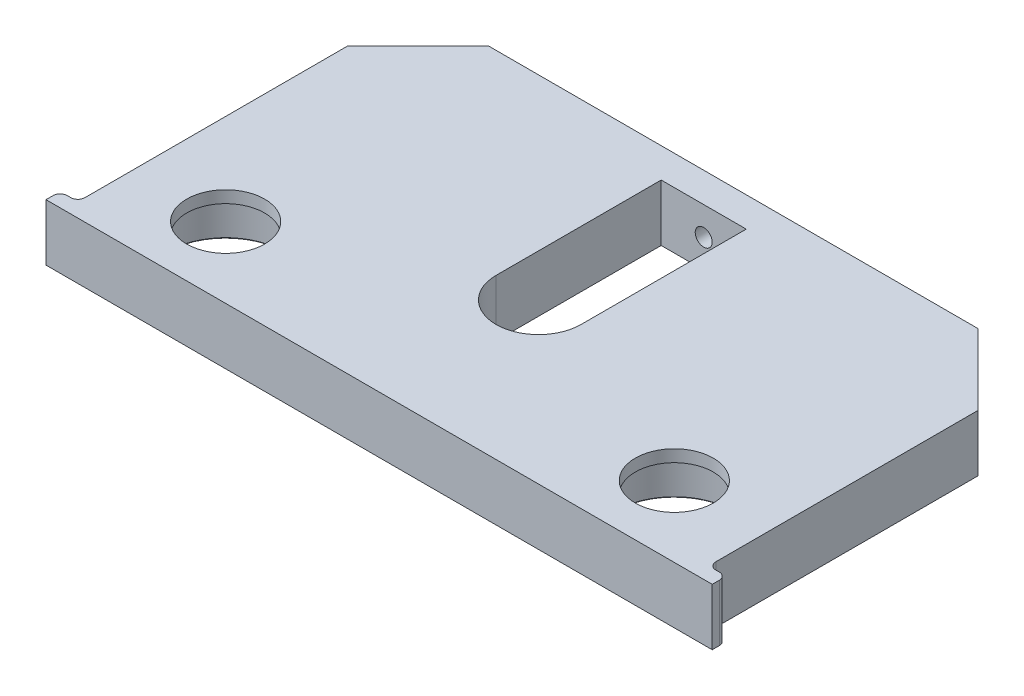
ISO-10303-21;
HEADER;
FILE_DESCRIPTION(('STEP AP214'),'2;1');
FILE_NAME('part.step','',(''),(''),'','','');
FILE_SCHEMA(('AUTOMOTIVE_DESIGN { 1 0 10303 214 1 1 1 1 }'));
ENDSEC;
DATA;
#1=APPLICATION_CONTEXT('core data for automotive mechanical design processes');
#2=APPLICATION_PROTOCOL_DEFINITION('international standard','automotive_design',2000,#1);
#3=PRODUCT_CONTEXT('',#1,'mechanical');
#4=PRODUCT('Part','Part','',(#3));
#5=PRODUCT_RELATED_PRODUCT_CATEGORY('part','',(#4));
#6=PRODUCT_DEFINITION_FORMATION('','',#4);
#7=PRODUCT_DEFINITION_CONTEXT('part definition',#1,'design');
#8=PRODUCT_DEFINITION('design','',#6,#7);
#9=PRODUCT_DEFINITION_SHAPE('','',#8);
#10=(LENGTH_UNIT() NAMED_UNIT(*) SI_UNIT(.MILLI.,.METRE.));
#11=(NAMED_UNIT(*) PLANE_ANGLE_UNIT() SI_UNIT($,.RADIAN.));
#12=(NAMED_UNIT(*) SI_UNIT($,.STERADIAN.) SOLID_ANGLE_UNIT());
#13=UNCERTAINTY_MEASURE_WITH_UNIT(LENGTH_MEASURE(1.E-05),#10,'distance_accuracy_value','');
#14=(GEOMETRIC_REPRESENTATION_CONTEXT(3) GLOBAL_UNCERTAINTY_ASSIGNED_CONTEXT((#13)) GLOBAL_UNIT_ASSIGNED_CONTEXT((#10,
#11,#12)) REPRESENTATION_CONTEXT('',''));
#15=CARTESIAN_POINT('',(0.,0.,0.));
#16=DIRECTION('',(0.,0.,1.));
#17=DIRECTION('',(1.,0.,0.));
#18=AXIS2_PLACEMENT_3D('',#15,#16,#17);
#19=CARTESIAN_POINT('',(-316.5,40.,-100.));
#20=DIRECTION('',(0.,-1.,0.));
#21=DIRECTION('',(0.,0.,-1.));
#22=AXIS2_PLACEMENT_3D('',#19,#20,#21);
#23=CYLINDRICAL_SURFACE('',#22,55.);
#24=CARTESIAN_POINT('',(-316.5,40.,-100.));
#25=DIRECTION('',(0.,1.,0.));
#26=DIRECTION('',(0.,0.,1.));
#27=AXIS2_PLACEMENT_3D('',#24,#25,#26);
#28=CIRCLE('',#27,55.);
#29=CARTESIAN_POINT('',(-316.5,40.,-45.));
#30=VERTEX_POINT('',#29);
#31=EDGE_CURVE('E231',#30,#30,#28,.T.);
#32=ORIENTED_EDGE('',*,*,#31,.T.);
#33=EDGE_LOOP('',(#32));
#34=FACE_BOUND('',#33,.T.);
#35=CARTESIAN_POINT('',(-316.5,23.,-100.));
#36=DIRECTION('',(0.,-1.,0.));
#37=DIRECTION('',(0.,0.,-1.));
#38=AXIS2_PLACEMENT_3D('',#35,#36,#37);
#39=CIRCLE('',#38,55.);
#40=CARTESIAN_POINT('',(-316.5,23.,-155.));
#41=VERTEX_POINT('',#40);
#42=EDGE_CURVE('E327',#41,#41,#39,.T.);
#43=ORIENTED_EDGE('',*,*,#42,.T.);
#44=EDGE_LOOP('',(#43));
#45=FACE_BOUND('',#44,.T.);
#46=ADVANCED_FACE('F47',(#34,#45),#23,.F.);
#47=CARTESIAN_POINT('',(316.5,40.,-100.));
#48=DIRECTION('',(0.,-1.,0.));
#49=DIRECTION('',(0.,0.,-1.));
#50=AXIS2_PLACEMENT_3D('',#47,#48,#49);
#51=CYLINDRICAL_SURFACE('',#50,55.);
#52=CARTESIAN_POINT('',(316.5,40.,-100.));
#53=DIRECTION('',(0.,1.,0.));
#54=DIRECTION('',(0.,0.,1.));
#55=AXIS2_PLACEMENT_3D('',#52,#53,#54);
#56=CIRCLE('',#55,55.);
#57=CARTESIAN_POINT('',(316.5,40.,-45.));
#58=VERTEX_POINT('',#57);
#59=EDGE_CURVE('E234',#58,#58,#56,.F.);
#60=ORIENTED_EDGE('',*,*,#59,.F.);
#61=EDGE_LOOP('',(#60));
#62=FACE_BOUND('',#61,.T.);
#63=CARTESIAN_POINT('',(316.5,23.,-100.));
#64=DIRECTION('',(0.,-1.,0.));
#65=DIRECTION('',(0.,0.,-1.));
#66=AXIS2_PLACEMENT_3D('',#63,#64,#65);
#67=CIRCLE('',#66,55.);
#68=CARTESIAN_POINT('',(316.5,23.,-155.));
#69=VERTEX_POINT('',#68);
#70=EDGE_CURVE('E324',#69,#69,#67,.F.);
#71=ORIENTED_EDGE('',*,*,#70,.F.);
#72=EDGE_LOOP('',(#71));
#73=FACE_BOUND('',#72,.T.);
#74=ADVANCED_FACE('F368',(#62,#73),#51,.F.);
#75=CARTESIAN_POINT('',(-445.,40.,1.30012959462683E-13));
#76=DIRECTION('',(1.,0.,0.));
#77=DIRECTION('',(0.,0.,-1.));
#78=AXIS2_PLACEMENT_3D('',#75,#76,#77);
#79=PLANE('',#78);
#80=DIRECTION('',(0.,0.,1.));
#81=VECTOR('',#80,1.);
#82=CARTESIAN_POINT('',(-445.,-40.,1.30012959462683E-13));
#83=LINE('',#82,#81);
#84=CARTESIAN_POINT('',(-445.,-40.,-400.));
#85=VERTEX_POINT('',#84);
#86=CARTESIAN_POINT('',(-445.,-40.,-30.));
#87=VERTEX_POINT('',#86);
#88=EDGE_CURVE('E247',#85,#87,#83,.T.);
#89=ORIENTED_EDGE('',*,*,#88,.T.);
#90=DIRECTION('',(0.,-1.,0.));
#91=VECTOR('',#90,1.);
#92=CARTESIAN_POINT('',(-445.,40.,-30.));
#93=LINE('',#92,#91);
#94=CARTESIAN_POINT('',(-445.,40.,-30.));
#95=VERTEX_POINT('',#94);
#96=EDGE_CURVE('E304',#87,#95,#93,.F.);
#97=ORIENTED_EDGE('',*,*,#96,.T.);
#98=DIRECTION('',(0.,0.,1.));
#99=VECTOR('',#98,1.);
#100=CARTESIAN_POINT('',(-445.,40.,1.30012959462683E-13));
#101=LINE('',#100,#99);
#102=CARTESIAN_POINT('',(-445.,40.,-400.));
#103=VERTEX_POINT('',#102);
#104=EDGE_CURVE('E208',#103,#95,#101,.T.);
#105=ORIENTED_EDGE('',*,*,#104,.F.);
#106=DIRECTION('',(0.,-1.,0.));
#107=VECTOR('',#106,1.);
#108=CARTESIAN_POINT('',(-445.,40.,-400.));
#109=LINE('',#108,#107);
#110=EDGE_CURVE('E184',#103,#85,#109,.T.);
#111=ORIENTED_EDGE('',*,*,#110,.T.);
#112=EDGE_LOOP('',(#89,#97,#105,#111));
#113=FACE_BOUND('',#112,.T.);
#114=ADVANCED_FACE('F375',(#113),#79,.F.);
#115=CARTESIAN_POINT('',(0.,40.,-20.0000000000002));
#116=DIRECTION('',(0.,0.,1.));
#117=DIRECTION('',(1.,0.,0.));
#118=AXIS2_PLACEMENT_3D('',#115,#116,#117);
#119=PLANE('',#118);
#120=DIRECTION('',(-1.,0.,0.));
#121=VECTOR('',#120,1.);
#122=CARTESIAN_POINT('',(0.,-40.,-20.0000000000002));
#123=LINE('',#122,#121);
#124=CARTESIAN_POINT('',(-455.,-40.,-20.));
#125=VERTEX_POINT('',#124);
#126=CARTESIAN_POINT('',(-460.,-40.,-20.));
#127=VERTEX_POINT('',#126);
#128=EDGE_CURVE('E250',#125,#127,#123,.T.);
#129=ORIENTED_EDGE('',*,*,#128,.T.);
#130=DIRECTION('',(0.,-1.,0.));
#131=VECTOR('',#130,1.);
#132=CARTESIAN_POINT('',(-460.,40.,-20.));
#133=LINE('',#132,#131);
#134=CARTESIAN_POINT('',(-460.,40.,-20.));
#135=VERTEX_POINT('',#134);
#136=EDGE_CURVE('E299',#127,#135,#133,.F.);
#137=ORIENTED_EDGE('',*,*,#136,.T.);
#138=DIRECTION('',(-1.,0.,0.));
#139=VECTOR('',#138,1.);
#140=CARTESIAN_POINT('',(0.,40.,-20.0000000000002));
#141=LINE('',#140,#139);
#142=CARTESIAN_POINT('',(-455.,40.,-20.));
#143=VERTEX_POINT('',#142);
#144=EDGE_CURVE('E211',#143,#135,#141,.T.);
#145=ORIENTED_EDGE('',*,*,#144,.F.);
#146=DIRECTION('',(0.,-1.,0.));
#147=VECTOR('',#146,1.);
#148=CARTESIAN_POINT('',(-455.,-40.,-20.));
#149=LINE('',#148,#147);
#150=EDGE_CURVE('E296',#143,#125,#149,.T.);
#151=ORIENTED_EDGE('',*,*,#150,.T.);
#152=EDGE_LOOP('',(#129,#137,#145,#151));
#153=FACE_BOUND('',#152,.T.);
#154=ADVANCED_FACE('F414',(#153),#119,.F.);
#155=CARTESIAN_POINT('',(-470.,40.,0.));
#156=DIRECTION('',(1.,0.,0.));
#157=DIRECTION('',(0.,0.,-1.));
#158=AXIS2_PLACEMENT_3D('',#155,#156,#157);
#159=PLANE('',#158);
#160=DIRECTION('',(0.,0.,1.));
#161=VECTOR('',#160,1.);
#162=CARTESIAN_POINT('',(-470.,40.,0.));
#163=LINE('',#162,#161);
#164=CARTESIAN_POINT('',(-470.,40.,-9.99999999999999));
#165=VERTEX_POINT('',#164);
#166=CARTESIAN_POINT('',(-470.,40.,0.));
#167=VERTEX_POINT('',#166);
#168=EDGE_CURVE('E214',#165,#167,#163,.T.);
#169=ORIENTED_EDGE('',*,*,#168,.F.);
#170=DIRECTION('',(0.,-1.,0.));
#171=VECTOR('',#170,1.);
#172=CARTESIAN_POINT('',(-470.,40.,-9.99999999999999));
#173=LINE('',#172,#171);
#174=CARTESIAN_POINT('',(-470.,-40.,-9.99999999999999));
#175=VERTEX_POINT('',#174);
#176=EDGE_CURVE('E285',#165,#175,#173,.T.);
#177=ORIENTED_EDGE('',*,*,#176,.T.);
#178=DIRECTION('',(0.,0.,1.));
#179=VECTOR('',#178,1.);
#180=CARTESIAN_POINT('',(-470.,-40.,0.));
#181=LINE('',#180,#179);
#182=CARTESIAN_POINT('',(-470.,-40.,0.));
#183=VERTEX_POINT('',#182);
#184=EDGE_CURVE('E253',#175,#183,#181,.T.);
#185=ORIENTED_EDGE('',*,*,#184,.T.);
#186=DIRECTION('',(0.,-1.,0.));
#187=VECTOR('',#186,1.);
#188=CARTESIAN_POINT('',(-470.,40.,0.));
#189=LINE('',#188,#187);
#190=EDGE_CURVE('E282',#167,#183,#189,.T.);
#191=ORIENTED_EDGE('',*,*,#190,.F.);
#192=EDGE_LOOP('',(#169,#177,#185,#191));
#193=FACE_BOUND('',#192,.T.);
#194=ADVANCED_FACE('F410',(#193),#159,.F.);
#195=CARTESIAN_POINT('',(0.,40.,-2.55378105461486E-13));
#196=DIRECTION('',(0.,0.,-1.));
#197=DIRECTION('',(-1.,0.,0.));
#198=AXIS2_PLACEMENT_3D('',#195,#196,#197);
#199=PLANE('',#198);
#200=DIRECTION('',(1.,0.,0.));
#201=VECTOR('',#200,1.);
#202=CARTESIAN_POINT('',(0.,-40.,-2.55378105461486E-13));
#203=LINE('',#202,#201);
#204=CARTESIAN_POINT('',(470.,-40.,0.));
#205=VERTEX_POINT('',#204);
#206=EDGE_CURVE('E255',#183,#205,#203,.T.);
#207=ORIENTED_EDGE('',*,*,#206,.T.);
#208=DIRECTION('',(0.,-1.,0.));
#209=VECTOR('',#208,1.);
#210=CARTESIAN_POINT('',(470.,40.,0.));
#211=LINE('',#210,#209);
#212=CARTESIAN_POINT('',(470.,40.,0.));
#213=VERTEX_POINT('',#212);
#214=EDGE_CURVE('E279',#213,#205,#211,.T.);
#215=ORIENTED_EDGE('',*,*,#214,.F.);
#216=DIRECTION('',(1.,0.,0.));
#217=VECTOR('',#216,1.);
#218=CARTESIAN_POINT('',(0.,40.,-2.55378105461486E-13));
#219=LINE('',#218,#217);
#220=EDGE_CURVE('E216',#167,#213,#219,.T.);
#221=ORIENTED_EDGE('',*,*,#220,.F.);
#222=ORIENTED_EDGE('',*,*,#190,.T.);
#223=EDGE_LOOP('',(#207,#215,#221,#222));
#224=FACE_BOUND('',#223,.T.);
#225=ADVANCED_FACE('F406',(#224),#199,.F.);
#226=CARTESIAN_POINT('',(470.,40.,0.));
#227=DIRECTION('',(1.,0.,0.));
#228=DIRECTION('',(0.,0.,-1.));
#229=AXIS2_PLACEMENT_3D('',#226,#227,#228);
#230=PLANE('',#229);
#231=DIRECTION('',(0.,0.,1.));
#232=VECTOR('',#231,1.);
#233=CARTESIAN_POINT('',(470.,-40.,0.));
#234=LINE('',#233,#232);
#235=CARTESIAN_POINT('',(470.,-40.,-9.99999999999999));
#236=VERTEX_POINT('',#235);
#237=EDGE_CURVE('E258',#236,#205,#234,.T.);
#238=ORIENTED_EDGE('',*,*,#237,.F.);
#239=DIRECTION('',(0.,-1.,0.));
#240=VECTOR('',#239,1.);
#241=CARTESIAN_POINT('',(470.,40.,-9.99999999999999));
#242=LINE('',#241,#240);
#243=CARTESIAN_POINT('',(470.,40.,-9.99999999999999));
#244=VERTEX_POINT('',#243);
#245=EDGE_CURVE('E311',#236,#244,#242,.F.);
#246=ORIENTED_EDGE('',*,*,#245,.T.);
#247=DIRECTION('',(0.,0.,1.));
#248=VECTOR('',#247,1.);
#249=CARTESIAN_POINT('',(470.,40.,0.));
#250=LINE('',#249,#248);
#251=EDGE_CURVE('E219',#244,#213,#250,.T.);
#252=ORIENTED_EDGE('',*,*,#251,.T.);
#253=ORIENTED_EDGE('',*,*,#214,.T.);
#254=EDGE_LOOP('',(#238,#246,#252,#253));
#255=FACE_BOUND('',#254,.T.);
#256=ADVANCED_FACE('F402',(#255),#230,.T.);
#257=CARTESIAN_POINT('',(0.,40.,-20.0000000000002));
#258=DIRECTION('',(0.,0.,-1.));
#259=DIRECTION('',(-1.,0.,0.));
#260=AXIS2_PLACEMENT_3D('',#257,#258,#259);
#261=PLANE('',#260);
#262=DIRECTION('',(1.,0.,0.));
#263=VECTOR('',#262,1.);
#264=CARTESIAN_POINT('',(0.,40.,-20.0000000000002));
#265=LINE('',#264,#263);
#266=CARTESIAN_POINT('',(455.,40.,-20.));
#267=VERTEX_POINT('',#266);
#268=CARTESIAN_POINT('',(460.,40.,-20.));
#269=VERTEX_POINT('',#268);
#270=EDGE_CURVE('E221',#267,#269,#265,.T.);
#271=ORIENTED_EDGE('',*,*,#270,.T.);
#272=DIRECTION('',(0.,-1.,0.));
#273=VECTOR('',#272,1.);
#274=CARTESIAN_POINT('',(460.,40.,-20.));
#275=LINE('',#274,#273);
#276=CARTESIAN_POINT('',(460.,-40.,-20.));
#277=VERTEX_POINT('',#276);
#278=EDGE_CURVE('E308',#269,#277,#275,.T.);
#279=ORIENTED_EDGE('',*,*,#278,.T.);
#280=DIRECTION('',(1.,0.,0.));
#281=VECTOR('',#280,1.);
#282=CARTESIAN_POINT('',(0.,-40.,-20.0000000000002));
#283=LINE('',#282,#281);
#284=CARTESIAN_POINT('',(455.,-40.,-20.));
#285=VERTEX_POINT('',#284);
#286=EDGE_CURVE('E260',#285,#277,#283,.T.);
#287=ORIENTED_EDGE('',*,*,#286,.F.);
#288=DIRECTION('',(0.,-1.,0.));
#289=VECTOR('',#288,1.);
#290=CARTESIAN_POINT('',(455.,40.,-20.));
#291=LINE('',#290,#289);
#292=EDGE_CURVE('E306',#285,#267,#291,.F.);
#293=ORIENTED_EDGE('',*,*,#292,.T.);
#294=EDGE_LOOP('',(#271,#279,#287,#293));
#295=FACE_BOUND('',#294,.T.);
#296=ADVANCED_FACE('F398',(#295),#261,.T.);
#297=CARTESIAN_POINT('',(445.,40.,0.));
#298=DIRECTION('',(-1.,0.,0.));
#299=DIRECTION('',(0.,0.,1.));
#300=AXIS2_PLACEMENT_3D('',#297,#298,#299);
#301=PLANE('',#300);
#302=DIRECTION('',(0.,0.,-1.));
#303=VECTOR('',#302,1.);
#304=CARTESIAN_POINT('',(445.,40.,0.));
#305=LINE('',#304,#303);
#306=CARTESIAN_POINT('',(445.,40.,-30.));
#307=VERTEX_POINT('',#306);
#308=CARTESIAN_POINT('',(445.,40.,-400.));
#309=VERTEX_POINT('',#308);
#310=EDGE_CURVE('E223',#307,#309,#305,.T.);
#311=ORIENTED_EDGE('',*,*,#310,.F.);
#312=DIRECTION('',(0.,-1.,0.));
#313=VECTOR('',#312,1.);
#314=CARTESIAN_POINT('',(445.,40.,-30.));
#315=LINE('',#314,#313);
#316=CARTESIAN_POINT('',(445.,-40.,-30.));
#317=VERTEX_POINT('',#316);
#318=EDGE_CURVE('E313',#307,#317,#315,.T.);
#319=ORIENTED_EDGE('',*,*,#318,.T.);
#320=DIRECTION('',(0.,0.,-1.));
#321=VECTOR('',#320,1.);
#322=CARTESIAN_POINT('',(445.,-40.,0.));
#323=LINE('',#322,#321);
#324=CARTESIAN_POINT('',(445.,-40.,-400.));
#325=VERTEX_POINT('',#324);
#326=EDGE_CURVE('E263',#317,#325,#323,.T.);
#327=ORIENTED_EDGE('',*,*,#326,.T.);
#328=DIRECTION('',(0.,-1.,0.));
#329=VECTOR('',#328,1.);
#330=CARTESIAN_POINT('',(445.,40.,-400.));
#331=LINE('',#330,#329);
#332=EDGE_CURVE('E276',#309,#325,#331,.T.);
#333=ORIENTED_EDGE('',*,*,#332,.F.);
#334=EDGE_LOOP('',(#311,#319,#327,#333));
#335=FACE_BOUND('',#334,.T.);
#336=ADVANCED_FACE('F394',(#335),#301,.F.);
#337=CARTESIAN_POINT('',(422.5,40.,-422.5));
#338=DIRECTION('',(-0.707106781186548,0.,0.707106781186548));
#339=DIRECTION('',(0.707106781186548,0.,0.707106781186548));
#340=AXIS2_PLACEMENT_3D('',#337,#338,#339);
#341=PLANE('',#340);
#342=DIRECTION('',(-0.707106781186548,0.,-0.707106781186548));
#343=VECTOR('',#342,1.);
#344=CARTESIAN_POINT('',(422.5,-40.,-422.5));
#345=LINE('',#344,#343);
#346=CARTESIAN_POINT('',(345.,-40.,-500.));
#347=VERTEX_POINT('',#346);
#348=EDGE_CURVE('E265',#325,#347,#345,.T.);
#349=ORIENTED_EDGE('',*,*,#348,.T.);
#350=DIRECTION('',(0.,-1.,0.));
#351=VECTOR('',#350,1.);
#352=CARTESIAN_POINT('',(345.,40.,-500.));
#353=LINE('',#352,#351);
#354=CARTESIAN_POINT('',(345.,40.,-500.));
#355=VERTEX_POINT('',#354);
#356=EDGE_CURVE('E273',#355,#347,#353,.T.);
#357=ORIENTED_EDGE('',*,*,#356,.F.);
#358=DIRECTION('',(-0.707106781186548,0.,-0.707106781186548));
#359=VECTOR('',#358,1.);
#360=CARTESIAN_POINT('',(422.5,40.,-422.5));
#361=LINE('',#360,#359);
#362=EDGE_CURVE('E225',#309,#355,#361,.T.);
#363=ORIENTED_EDGE('',*,*,#362,.F.);
#364=ORIENTED_EDGE('',*,*,#332,.T.);
#365=EDGE_LOOP('',(#349,#357,#363,#364));
#366=FACE_BOUND('',#365,.T.);
#367=ADVANCED_FACE('F390',(#366),#341,.F.);
#368=CARTESIAN_POINT('',(-2.41352831440251E-13,40.,-500.));
#369=DIRECTION('',(0.,0.,1.));
#370=DIRECTION('',(1.,0.,0.));
#371=AXIS2_PLACEMENT_3D('',#368,#369,#370);
#372=PLANE('',#371);
#373=CARTESIAN_POINT('',(0.,0.,-500.));
#374=DIRECTION('',(0.,0.,1.));
#375=DIRECTION('',(1.,0.,0.));
#376=AXIS2_PLACEMENT_3D('',#373,#374,#375);
#377=CIRCLE('',#376,12.);
#378=CARTESIAN_POINT('',(12.,0.,-500.));
#379=VERTEX_POINT('',#378);
#380=EDGE_CURVE('E203',#379,#379,#377,.T.);
#381=ORIENTED_EDGE('',*,*,#380,.T.);
#382=EDGE_LOOP('',(#381));
#383=FACE_BOUND('',#382,.T.);
#384=DIRECTION('',(-1.,0.,0.));
#385=VECTOR('',#384,1.);
#386=CARTESIAN_POINT('',(-2.41352831440251E-13,-40.,-500.));
#387=LINE('',#386,#385);
#388=CARTESIAN_POINT('',(-345.,-40.,-500.));
#389=VERTEX_POINT('',#388);
#390=EDGE_CURVE('E200',#347,#389,#387,.T.);
#391=ORIENTED_EDGE('',*,*,#390,.T.);
#392=DIRECTION('',(0.,-1.,0.));
#393=VECTOR('',#392,1.);
#394=CARTESIAN_POINT('',(-345.,40.,-500.));
#395=LINE('',#394,#393);
#396=CARTESIAN_POINT('',(-345.,40.,-500.));
#397=VERTEX_POINT('',#396);
#398=EDGE_CURVE('E270',#397,#389,#395,.T.);
#399=ORIENTED_EDGE('',*,*,#398,.F.);
#400=DIRECTION('',(-1.,0.,0.));
#401=VECTOR('',#400,1.);
#402=CARTESIAN_POINT('',(-2.41352831440251E-13,40.,-500.));
#403=LINE('',#402,#401);
#404=EDGE_CURVE('E227',#355,#397,#403,.T.);
#405=ORIENTED_EDGE('',*,*,#404,.F.);
#406=ORIENTED_EDGE('',*,*,#356,.T.);
#407=EDGE_LOOP('',(#391,#399,#405,#406));
#408=FACE_BOUND('',#407,.T.);
#409=ADVANCED_FACE('F387',(#383,#408),#372,.F.);
#410=CARTESIAN_POINT('',(0.,40.,-225.));
#411=DIRECTION('',(0.,-1.,0.));
#412=DIRECTION('',(0.,0.,-1.));
#413=AXIS2_PLACEMENT_3D('',#410,#411,#412);
#414=CYLINDRICAL_SURFACE('',#413,60.);
#415=CARTESIAN_POINT('',(0.,-40.,-225.));
#416=DIRECTION('',(0.,1.,0.));
#417=DIRECTION('',(0.,0.,1.));
#418=AXIS2_PLACEMENT_3D('',#415,#416,#417);
#419=CIRCLE('',#418,60.);
#420=CARTESIAN_POINT('',(-60.,-40.,-225.));
#421=VERTEX_POINT('',#420);
#422=CARTESIAN_POINT('',(60.,-40.,-225.));
#423=VERTEX_POINT('',#422);
#424=EDGE_CURVE('E181',#421,#423,#419,.T.);
#425=ORIENTED_EDGE('',*,*,#424,.F.);
#426=DIRECTION('',(0.,-1.,0.));
#427=VECTOR('',#426,1.);
#428=CARTESIAN_POINT('',(-60.,40.,-225.));
#429=LINE('',#428,#427);
#430=CARTESIAN_POINT('',(-60.,40.,-225.));
#431=VERTEX_POINT('',#430);
#432=EDGE_CURVE('E174',#431,#421,#429,.T.);
#433=ORIENTED_EDGE('',*,*,#432,.F.);
#434=CARTESIAN_POINT('',(0.,40.,-225.));
#435=DIRECTION('',(0.,1.,0.));
#436=DIRECTION('',(0.,0.,1.));
#437=AXIS2_PLACEMENT_3D('',#434,#435,#436);
#438=CIRCLE('',#437,60.);
#439=CARTESIAN_POINT('',(60.,40.,-225.));
#440=VERTEX_POINT('',#439);
#441=EDGE_CURVE('E178',#431,#440,#438,.T.);
#442=ORIENTED_EDGE('',*,*,#441,.T.);
#443=DIRECTION('',(0.,-1.,0.));
#444=VECTOR('',#443,1.);
#445=CARTESIAN_POINT('',(60.,40.,-225.));
#446=LINE('',#445,#444);
#447=EDGE_CURVE('E237',#440,#423,#446,.T.);
#448=ORIENTED_EDGE('',*,*,#447,.T.);
#449=EDGE_LOOP('',(#425,#433,#442,#448));
#450=FACE_BOUND('',#449,.T.);
#451=ADVANCED_FACE('F176',(#450),#414,.F.);
#452=CARTESIAN_POINT('',(-60.,40.,0.));
#453=DIRECTION('',(-1.,0.,0.));
#454=DIRECTION('',(0.,0.,1.));
#455=AXIS2_PLACEMENT_3D('',#452,#453,#454);
#456=PLANE('',#455);
#457=DIRECTION('',(0.,0.,-1.));
#458=VECTOR('',#457,1.);
#459=CARTESIAN_POINT('',(-60.,-40.,0.));
#460=LINE('',#459,#458);
#461=CARTESIAN_POINT('',(-60.,-40.,-458.));
#462=VERTEX_POINT('',#461);
#463=EDGE_CURVE('E239',#421,#462,#460,.T.);
#464=ORIENTED_EDGE('',*,*,#463,.T.);
#465=DIRECTION('',(0.,-1.,0.));
#466=VECTOR('',#465,1.);
#467=CARTESIAN_POINT('',(-60.,40.,-458.));
#468=LINE('',#467,#466);
#469=CARTESIAN_POINT('',(-60.,40.,-458.));
#470=VERTEX_POINT('',#469);
#471=EDGE_CURVE('E185',#470,#462,#468,.T.);
#472=ORIENTED_EDGE('',*,*,#471,.F.);
#473=DIRECTION('',(0.,0.,-1.));
#474=VECTOR('',#473,1.);
#475=CARTESIAN_POINT('',(-60.,40.,0.));
#476=LINE('',#475,#474);
#477=EDGE_CURVE('E188',#431,#470,#476,.T.);
#478=ORIENTED_EDGE('',*,*,#477,.F.);
#479=ORIENTED_EDGE('',*,*,#432,.T.);
#480=EDGE_LOOP('',(#464,#472,#478,#479));
#481=FACE_BOUND('',#480,.T.);
#482=ADVANCED_FACE('F189',(#481),#456,.F.);
#483=CARTESIAN_POINT('',(0.,40.,-458.));
#484=DIRECTION('',(0.,0.,-1.));
#485=DIRECTION('',(-1.,0.,0.));
#486=AXIS2_PLACEMENT_3D('',#483,#484,#485);
#487=PLANE('',#486);
#488=CARTESIAN_POINT('',(0.,0.,-458.));
#489=DIRECTION('',(0.,0.,1.));
#490=DIRECTION('',(1.,0.,0.));
#491=AXIS2_PLACEMENT_3D('',#488,#489,#490);
#492=CIRCLE('',#491,12.);
#493=CARTESIAN_POINT('',(12.,0.,-458.));
#494=VERTEX_POINT('',#493);
#495=EDGE_CURVE('E330',#494,#494,#492,.T.);
#496=ORIENTED_EDGE('',*,*,#495,.F.);
#497=EDGE_LOOP('',(#496));
#498=FACE_BOUND('',#497,.T.);
#499=DIRECTION('',(1.,0.,0.));
#500=VECTOR('',#499,1.);
#501=CARTESIAN_POINT('',(0.,-40.,-458.));
#502=LINE('',#501,#500);
#503=CARTESIAN_POINT('',(60.,-40.,-458.));
#504=VERTEX_POINT('',#503);
#505=EDGE_CURVE('E241',#462,#504,#502,.T.);
#506=ORIENTED_EDGE('',*,*,#505,.T.);
#507=DIRECTION('',(0.,-1.,0.));
#508=VECTOR('',#507,1.);
#509=CARTESIAN_POINT('',(60.,40.,-458.));
#510=LINE('',#509,#508);
#511=CARTESIAN_POINT('',(60.,40.,-458.));
#512=VERTEX_POINT('',#511);
#513=EDGE_CURVE('E287',#512,#504,#510,.T.);
#514=ORIENTED_EDGE('',*,*,#513,.F.);
#515=DIRECTION('',(1.,0.,0.));
#516=VECTOR('',#515,1.);
#517=CARTESIAN_POINT('',(0.,40.,-458.));
#518=LINE('',#517,#516);
#519=EDGE_CURVE('E193',#470,#512,#518,.T.);
#520=ORIENTED_EDGE('',*,*,#519,.F.);
#521=ORIENTED_EDGE('',*,*,#471,.T.);
#522=EDGE_LOOP('',(#506,#514,#520,#521));
#523=FACE_BOUND('',#522,.T.);
#524=ADVANCED_FACE('F385',(#498,#523),#487,.F.);
#525=CARTESIAN_POINT('',(-422.5,40.,-422.5));
#526=DIRECTION('',(0.707106781186547,0.,0.707106781186548));
#527=DIRECTION('',(0.707106781186548,0.,-0.707106781186547));
#528=AXIS2_PLACEMENT_3D('',#525,#526,#527);
#529=PLANE('',#528);
#530=DIRECTION('',(-0.707106781186548,0.,0.707106781186547));
#531=VECTOR('',#530,1.);
#532=CARTESIAN_POINT('',(-422.5,-40.,-422.5));
#533=LINE('',#532,#531);
#534=EDGE_CURVE('E198',#389,#85,#533,.T.);
#535=ORIENTED_EDGE('',*,*,#534,.T.);
#536=ORIENTED_EDGE('',*,*,#110,.F.);
#537=DIRECTION('',(-0.707106781186548,0.,0.707106781186547));
#538=VECTOR('',#537,1.);
#539=CARTESIAN_POINT('',(-422.5,40.,-422.5));
#540=LINE('',#539,#538);
#541=EDGE_CURVE('E229',#397,#103,#540,.T.);
#542=ORIENTED_EDGE('',*,*,#541,.F.);
#543=ORIENTED_EDGE('',*,*,#398,.T.);
#544=EDGE_LOOP('',(#535,#536,#542,#543));
#545=FACE_BOUND('',#544,.T.);
#546=ADVANCED_FACE('F381',(#545),#529,.F.);
#547=CARTESIAN_POINT('',(60.,40.,0.));
#548=DIRECTION('',(-1.,0.,0.));
#549=DIRECTION('',(0.,0.,1.));
#550=AXIS2_PLACEMENT_3D('',#547,#548,#549);
#551=PLANE('',#550);
#552=DIRECTION('',(0.,0.,-1.));
#553=VECTOR('',#552,1.);
#554=CARTESIAN_POINT('',(60.,-40.,0.));
#555=LINE('',#554,#553);
#556=EDGE_CURVE('E244',#423,#504,#555,.T.);
#557=ORIENTED_EDGE('',*,*,#556,.F.);
#558=ORIENTED_EDGE('',*,*,#447,.F.);
#559=DIRECTION('',(0.,0.,-1.));
#560=VECTOR('',#559,1.);
#561=CARTESIAN_POINT('',(60.,40.,0.));
#562=LINE('',#561,#560);
#563=EDGE_CURVE('E197',#440,#512,#562,.T.);
#564=ORIENTED_EDGE('',*,*,#563,.T.);
#565=ORIENTED_EDGE('',*,*,#513,.T.);
#566=EDGE_LOOP('',(#557,#558,#564,#565));
#567=FACE_BOUND('',#566,.T.);
#568=ADVANCED_FACE('F384',(#567),#551,.T.);
#569=CARTESIAN_POINT('',(0.,40.,0.));
#570=DIRECTION('',(0.,1.,0.));
#571=DIRECTION('',(0.,0.,1.));
#572=AXIS2_PLACEMENT_3D('',#569,#570,#571);
#573=PLANE('',#572);
#574=ORIENTED_EDGE('',*,*,#441,.F.);
#575=ORIENTED_EDGE('',*,*,#477,.T.);
#576=ORIENTED_EDGE('',*,*,#519,.T.);
#577=ORIENTED_EDGE('',*,*,#563,.F.);
#578=EDGE_LOOP('',(#574,#575,#576,#577));
#579=FACE_BOUND('',#578,.T.);
#580=ORIENTED_EDGE('',*,*,#144,.T.);
#581=CARTESIAN_POINT('',(-460.,40.,-9.99999999999999));
#582=DIRECTION('',(0.,1.,0.));
#583=DIRECTION('',(0.,0.,1.));
#584=AXIS2_PLACEMENT_3D('',#581,#582,#583);
#585=CIRCLE('',#584,10.);
#586=EDGE_CURVE('E302',#135,#165,#585,.T.);
#587=ORIENTED_EDGE('',*,*,#586,.T.);
#588=ORIENTED_EDGE('',*,*,#168,.T.);
#589=ORIENTED_EDGE('',*,*,#220,.T.);
#590=ORIENTED_EDGE('',*,*,#251,.F.);
#591=CARTESIAN_POINT('',(460.,40.,-9.99999999999999));
#592=DIRECTION('',(0.,1.,0.));
#593=DIRECTION('',(0.,0.,1.));
#594=AXIS2_PLACEMENT_3D('',#591,#592,#593);
#595=CIRCLE('',#594,10.);
#596=EDGE_CURVE('E69',#244,#269,#595,.T.);
#597=ORIENTED_EDGE('',*,*,#596,.T.);
#598=ORIENTED_EDGE('',*,*,#270,.F.);
#599=CARTESIAN_POINT('',(455.,40.,-30.));
#600=DIRECTION('',(0.,1.,0.));
#601=DIRECTION('',(0.,0.,1.));
#602=AXIS2_PLACEMENT_3D('',#599,#600,#601);
#603=CIRCLE('',#602,10.);
#604=EDGE_CURVE('E63',#267,#307,#603,.F.);
#605=ORIENTED_EDGE('',*,*,#604,.T.);
#606=ORIENTED_EDGE('',*,*,#310,.T.);
#607=ORIENTED_EDGE('',*,*,#362,.T.);
#608=ORIENTED_EDGE('',*,*,#404,.T.);
#609=ORIENTED_EDGE('',*,*,#541,.T.);
#610=ORIENTED_EDGE('',*,*,#104,.T.);
#611=CARTESIAN_POINT('',(-455.,40.,-30.));
#612=DIRECTION('',(0.,1.,0.));
#613=DIRECTION('',(0.,0.,1.));
#614=AXIS2_PLACEMENT_3D('',#611,#612,#613);
#615=CIRCLE('',#614,10.);
#616=EDGE_CURVE('E318',#95,#143,#615,.F.);
#617=ORIENTED_EDGE('',*,*,#616,.T.);
#618=EDGE_LOOP('',(#580,#587,#588,#589,#590,#597,#598,#605,#606,#607,#608,#609,#610,#617));
#619=FACE_BOUND('',#618,.T.);
#620=ORIENTED_EDGE('',*,*,#31,.F.);
#621=EDGE_LOOP('',(#620));
#622=FACE_BOUND('',#621,.T.);
#623=ORIENTED_EDGE('',*,*,#59,.T.);
#624=EDGE_LOOP('',(#623));
#625=FACE_BOUND('',#624,.T.);
#626=ADVANCED_FACE('F195',(#579,#619,#622,#625),#573,.T.);
#627=CARTESIAN_POINT('',(0.,-40.,0.));
#628=DIRECTION('',(0.,1.,0.));
#629=DIRECTION('',(0.,0.,1.));
#630=AXIS2_PLACEMENT_3D('',#627,#628,#629);
#631=PLANE('',#630);
#632=CARTESIAN_POINT('',(-316.5,-40.,-100.));
#633=DIRECTION('',(0.,1.,0.));
#634=DIRECTION('',(0.,0.,1.));
#635=AXIS2_PLACEMENT_3D('',#632,#633,#634);
#636=CIRCLE('',#635,84.5);
#637=CARTESIAN_POINT('',(-316.5,-40.,-15.5));
#638=VERTEX_POINT('',#637);
#639=EDGE_CURVE('E339',#638,#638,#636,.T.);
#640=ORIENTED_EDGE('',*,*,#639,.T.);
#641=EDGE_LOOP('',(#640));
#642=FACE_BOUND('',#641,.T.);
#643=CARTESIAN_POINT('',(316.5,-40.,-100.));
#644=DIRECTION('',(0.,1.,0.));
#645=DIRECTION('',(0.,0.,1.));
#646=AXIS2_PLACEMENT_3D('',#643,#644,#645);
#647=CIRCLE('',#646,84.5);
#648=CARTESIAN_POINT('',(316.5,-40.,-15.5));
#649=VERTEX_POINT('',#648);
#650=EDGE_CURVE('E336',#649,#649,#647,.T.);
#651=ORIENTED_EDGE('',*,*,#650,.T.);
#652=EDGE_LOOP('',(#651));
#653=FACE_BOUND('',#652,.T.);
#654=ORIENTED_EDGE('',*,*,#424,.T.);
#655=ORIENTED_EDGE('',*,*,#556,.T.);
#656=ORIENTED_EDGE('',*,*,#505,.F.);
#657=ORIENTED_EDGE('',*,*,#463,.F.);
#658=EDGE_LOOP('',(#654,#655,#656,#657));
#659=FACE_BOUND('',#658,.T.);
#660=ORIENTED_EDGE('',*,*,#184,.F.);
#661=CARTESIAN_POINT('',(-460.,-40.,-9.99999999999999));
#662=DIRECTION('',(0.,1.,0.));
#663=DIRECTION('',(0.,0.,1.));
#664=AXIS2_PLACEMENT_3D('',#661,#662,#663);
#665=CIRCLE('',#664,10.);
#666=EDGE_CURVE('E294',#175,#127,#665,.F.);
#667=ORIENTED_EDGE('',*,*,#666,.T.);
#668=ORIENTED_EDGE('',*,*,#128,.F.);
#669=CARTESIAN_POINT('',(-455.,-40.,-30.));
#670=DIRECTION('',(0.,1.,0.));
#671=DIRECTION('',(0.,0.,1.));
#672=AXIS2_PLACEMENT_3D('',#669,#670,#671);
#673=CIRCLE('',#672,10.);
#674=EDGE_CURVE('E316',#125,#87,#673,.T.);
#675=ORIENTED_EDGE('',*,*,#674,.T.);
#676=ORIENTED_EDGE('',*,*,#88,.F.);
#677=ORIENTED_EDGE('',*,*,#534,.F.);
#678=ORIENTED_EDGE('',*,*,#390,.F.);
#679=ORIENTED_EDGE('',*,*,#348,.F.);
#680=ORIENTED_EDGE('',*,*,#326,.F.);
#681=CARTESIAN_POINT('',(455.,-40.,-30.));
#682=DIRECTION('',(0.,1.,0.));
#683=DIRECTION('',(0.,0.,1.));
#684=AXIS2_PLACEMENT_3D('',#681,#682,#683);
#685=CIRCLE('',#684,10.);
#686=EDGE_CURVE('E320',#317,#285,#685,.T.);
#687=ORIENTED_EDGE('',*,*,#686,.T.);
#688=ORIENTED_EDGE('',*,*,#286,.T.);
#689=CARTESIAN_POINT('',(460.,-40.,-9.99999999999999));
#690=DIRECTION('',(0.,1.,0.));
#691=DIRECTION('',(0.,0.,1.));
#692=AXIS2_PLACEMENT_3D('',#689,#690,#691);
#693=CIRCLE('',#692,10.);
#694=EDGE_CURVE('E292',#277,#236,#693,.F.);
#695=ORIENTED_EDGE('',*,*,#694,.T.);
#696=ORIENTED_EDGE('',*,*,#237,.T.);
#697=ORIENTED_EDGE('',*,*,#206,.F.);
#698=EDGE_LOOP('',(#660,#667,#668,#675,#676,#677,#678,#679,#680,#687,#688,#695,#696,#697));
#699=FACE_BOUND('',#698,.T.);
#700=ADVANCED_FACE('F436',(#642,#653,#659,#699),#631,.F.);
#701=CARTESIAN_POINT('',(-460.,40.,-9.99999999999999));
#702=DIRECTION('',(0.,-1.,0.));
#703=DIRECTION('',(0.,0.,-1.));
#704=AXIS2_PLACEMENT_3D('',#701,#702,#703);
#705=CYLINDRICAL_SURFACE('',#704,10.);
#706=ORIENTED_EDGE('',*,*,#586,.F.);
#707=ORIENTED_EDGE('',*,*,#136,.F.);
#708=ORIENTED_EDGE('',*,*,#666,.F.);
#709=ORIENTED_EDGE('',*,*,#176,.F.);
#710=EDGE_LOOP('',(#706,#707,#708,#709));
#711=FACE_BOUND('',#710,.T.);
#712=ADVANCED_FACE('F432',(#711),#705,.T.);
#713=CARTESIAN_POINT('',(-455.,40.,-30.));
#714=DIRECTION('',(0.,1.,0.));
#715=DIRECTION('',(0.,0.,1.));
#716=AXIS2_PLACEMENT_3D('',#713,#714,#715);
#717=CYLINDRICAL_SURFACE('',#716,10.);
#718=ORIENTED_EDGE('',*,*,#616,.F.);
#719=ORIENTED_EDGE('',*,*,#96,.F.);
#720=ORIENTED_EDGE('',*,*,#674,.F.);
#721=ORIENTED_EDGE('',*,*,#150,.F.);
#722=EDGE_LOOP('',(#718,#719,#720,#721));
#723=FACE_BOUND('',#722,.T.);
#724=ADVANCED_FACE('F435',(#723),#717,.F.);
#725=CARTESIAN_POINT('',(460.,40.,-9.99999999999999));
#726=DIRECTION('',(0.,-1.,0.));
#727=DIRECTION('',(0.,0.,-1.));
#728=AXIS2_PLACEMENT_3D('',#725,#726,#727);
#729=CYLINDRICAL_SURFACE('',#728,10.);
#730=ORIENTED_EDGE('',*,*,#596,.F.);
#731=ORIENTED_EDGE('',*,*,#245,.F.);
#732=ORIENTED_EDGE('',*,*,#694,.F.);
#733=ORIENTED_EDGE('',*,*,#278,.F.);
#734=EDGE_LOOP('',(#730,#731,#732,#733));
#735=FACE_BOUND('',#734,.T.);
#736=ADVANCED_FACE('F440',(#735),#729,.T.);
#737=CARTESIAN_POINT('',(455.,40.,-30.));
#738=DIRECTION('',(0.,-1.,0.));
#739=DIRECTION('',(0.,0.,-1.));
#740=AXIS2_PLACEMENT_3D('',#737,#738,#739);
#741=CYLINDRICAL_SURFACE('',#740,10.);
#742=ORIENTED_EDGE('',*,*,#604,.F.);
#743=ORIENTED_EDGE('',*,*,#292,.F.);
#744=ORIENTED_EDGE('',*,*,#686,.F.);
#745=ORIENTED_EDGE('',*,*,#318,.F.);
#746=EDGE_LOOP('',(#742,#743,#744,#745));
#747=FACE_BOUND('',#746,.T.);
#748=ADVANCED_FACE('F444',(#747),#741,.F.);
#749=CARTESIAN_POINT('',(0.,0.,-538.));
#750=DIRECTION('',(0.,0.,1.));
#751=DIRECTION('',(1.,0.,0.));
#752=AXIS2_PLACEMENT_3D('',#749,#750,#751);
#753=CYLINDRICAL_SURFACE('',#752,12.);
#754=ORIENTED_EDGE('',*,*,#495,.T.);
#755=EDGE_LOOP('',(#754));
#756=FACE_BOUND('',#755,.T.);
#757=ORIENTED_EDGE('',*,*,#380,.F.);
#758=EDGE_LOOP('',(#757));
#759=FACE_BOUND('',#758,.T.);
#760=ADVANCED_FACE('F448',(#756,#759),#753,.F.);
#761=CARTESIAN_POINT('',(316.5,23.,-100.));
#762=DIRECTION('',(0.,-1.,0.));
#763=DIRECTION('',(0.,0.,-1.));
#764=AXIS2_PLACEMENT_3D('',#761,#762,#763);
#765=PLANE('',#764);
#766=CARTESIAN_POINT('',(316.5,23.,-100.));
#767=DIRECTION('',(0.,-1.,0.));
#768=DIRECTION('',(0.,0.,-1.));
#769=AXIS2_PLACEMENT_3D('',#766,#767,#768);
#770=CIRCLE('',#769,80.5000000000001);
#771=CARTESIAN_POINT('',(316.5,23.,-180.5));
#772=VERTEX_POINT('',#771);
#773=EDGE_CURVE('E11',#772,#772,#770,.T.);
#774=ORIENTED_EDGE('',*,*,#773,.T.);
#775=EDGE_LOOP('',(#774));
#776=FACE_BOUND('',#775,.T.);
#777=ORIENTED_EDGE('',*,*,#70,.T.);
#778=EDGE_LOOP('',(#777));
#779=FACE_BOUND('',#778,.T.);
#780=ADVANCED_FACE('F484',(#776,#779),#765,.T.);
#781=CARTESIAN_POINT('',(316.5,23.,-100.));
#782=DIRECTION('',(0.,-1.,0.));
#783=DIRECTION('',(0.,0.,-1.));
#784=AXIS2_PLACEMENT_3D('',#781,#782,#783);
#785=CYLINDRICAL_SURFACE('',#784,82.5);
#786=CARTESIAN_POINT('',(316.5,-38.0000000000001,-100.));
#787=DIRECTION('',(0.,1.,0.));
#788=DIRECTION('',(0.,0.,1.));
#789=AXIS2_PLACEMENT_3D('',#786,#787,#788);
#790=CIRCLE('',#789,82.5);
#791=CARTESIAN_POINT('',(316.5,-38.0000000000001,-17.5));
#792=VERTEX_POINT('',#791);
#793=EDGE_CURVE('E56',#792,#792,#790,.F.);
#794=ORIENTED_EDGE('',*,*,#793,.T.);
#795=EDGE_LOOP('',(#794));
#796=FACE_BOUND('',#795,.T.);
#797=CARTESIAN_POINT('',(316.5,21.0000000000002,-100.));
#798=DIRECTION('',(0.,-1.,0.));
#799=DIRECTION('',(0.,0.,-1.));
#800=AXIS2_PLACEMENT_3D('',#797,#798,#799);
#801=CIRCLE('',#800,82.5);
#802=CARTESIAN_POINT('',(316.5,21.0000000000002,-182.5));
#803=VERTEX_POINT('',#802);
#804=EDGE_CURVE('E345',#803,#803,#801,.F.);
#805=ORIENTED_EDGE('',*,*,#804,.T.);
#806=EDGE_LOOP('',(#805));
#807=FACE_BOUND('',#806,.T.);
#808=ADVANCED_FACE('F350',(#796,#807),#785,.F.);
#809=CARTESIAN_POINT('',(-316.5,23.,-100.));
#810=DIRECTION('',(0.,-1.,0.));
#811=DIRECTION('',(0.,0.,-1.));
#812=AXIS2_PLACEMENT_3D('',#809,#810,#811);
#813=CYLINDRICAL_SURFACE('',#812,82.5);
#814=CARTESIAN_POINT('',(-316.5,-38.0000000000001,-100.));
#815=DIRECTION('',(0.,1.,0.));
#816=DIRECTION('',(0.,0.,1.));
#817=AXIS2_PLACEMENT_3D('',#814,#815,#816);
#818=CIRCLE('',#817,82.5);
#819=CARTESIAN_POINT('',(-316.5,-38.0000000000001,-17.5));
#820=VERTEX_POINT('',#819);
#821=EDGE_CURVE('E333',#820,#820,#818,.F.);
#822=ORIENTED_EDGE('',*,*,#821,.T.);
#823=EDGE_LOOP('',(#822));
#824=FACE_BOUND('',#823,.T.);
#825=CARTESIAN_POINT('',(-316.5,21.0000000000002,-100.));
#826=DIRECTION('',(0.,-1.,0.));
#827=DIRECTION('',(0.,0.,-1.));
#828=AXIS2_PLACEMENT_3D('',#825,#826,#827);
#829=CIRCLE('',#828,82.5);
#830=CARTESIAN_POINT('',(-316.5,21.0000000000002,-182.5));
#831=VERTEX_POINT('',#830);
#832=EDGE_CURVE('E323',#831,#831,#829,.F.);
#833=ORIENTED_EDGE('',*,*,#832,.T.);
#834=EDGE_LOOP('',(#833));
#835=FACE_BOUND('',#834,.T.);
#836=ADVANCED_FACE('F466',(#824,#835),#813,.F.);
#837=CARTESIAN_POINT('',(-316.5,23.,-100.));
#838=DIRECTION('',(0.,-1.,0.));
#839=DIRECTION('',(0.,0.,-1.));
#840=AXIS2_PLACEMENT_3D('',#837,#838,#839);
#841=PLANE('',#840);
#842=CARTESIAN_POINT('',(-316.5,23.,-100.));
#843=DIRECTION('',(0.,-1.,0.));
#844=DIRECTION('',(0.,0.,-1.));
#845=AXIS2_PLACEMENT_3D('',#842,#843,#844);
#846=CIRCLE('',#845,80.5000000000001);
#847=CARTESIAN_POINT('',(-316.5,23.,-180.5));
#848=VERTEX_POINT('',#847);
#849=EDGE_CURVE('E342',#848,#848,#846,.T.);
#850=ORIENTED_EDGE('',*,*,#849,.T.);
#851=EDGE_LOOP('',(#850));
#852=FACE_BOUND('',#851,.T.);
#853=ORIENTED_EDGE('',*,*,#42,.F.);
#854=EDGE_LOOP('',(#853));
#855=FACE_BOUND('',#854,.T.);
#856=ADVANCED_FACE('F455',(#852,#855),#841,.T.);
#857=CARTESIAN_POINT('',(-316.5,-38.0000000000001,-100.));
#858=DIRECTION('',(0.,-1.,0.));
#859=DIRECTION('',(0.,0.,-1.));
#860=AXIS2_PLACEMENT_3D('',#857,#858,#859);
#861=CONICAL_SURFACE('',#860,82.5,0.785398163397459);
#862=ORIENTED_EDGE('',*,*,#639,.F.);
#863=EDGE_LOOP('',(#862));
#864=FACE_BOUND('',#863,.T.);
#865=ORIENTED_EDGE('',*,*,#821,.F.);
#866=EDGE_LOOP('',(#865));
#867=FACE_BOUND('',#866,.T.);
#868=ADVANCED_FACE('F362',(#864,#867),#861,.F.);
#869=CARTESIAN_POINT('',(-316.5,23.,-100.));
#870=DIRECTION('',(0.,-1.,0.));
#871=DIRECTION('',(0.,0.,-1.));
#872=AXIS2_PLACEMENT_3D('',#869,#870,#871);
#873=CONICAL_SURFACE('',#872,80.5000000000001,0.785398163397466);
#874=ORIENTED_EDGE('',*,*,#832,.F.);
#875=EDGE_LOOP('',(#874));
#876=FACE_BOUND('',#875,.T.);
#877=ORIENTED_EDGE('',*,*,#849,.F.);
#878=EDGE_LOOP('',(#877));
#879=FACE_BOUND('',#878,.T.);
#880=ADVANCED_FACE('F355',(#876,#879),#873,.F.);
#881=CARTESIAN_POINT('',(316.5,-38.0000000000001,-100.));
#882=DIRECTION('',(0.,-1.,0.));
#883=DIRECTION('',(0.,0.,-1.));
#884=AXIS2_PLACEMENT_3D('',#881,#882,#883);
#885=CONICAL_SURFACE('',#884,82.5,0.785398163397459);
#886=ORIENTED_EDGE('',*,*,#650,.F.);
#887=EDGE_LOOP('',(#886));
#888=FACE_BOUND('',#887,.T.);
#889=ORIENTED_EDGE('',*,*,#793,.F.);
#890=EDGE_LOOP('',(#889));
#891=FACE_BOUND('',#890,.T.);
#892=ADVANCED_FACE('F353',(#888,#891),#885,.F.);
#893=CARTESIAN_POINT('',(316.5,23.,-100.));
#894=DIRECTION('',(0.,-1.,0.));
#895=DIRECTION('',(0.,0.,-1.));
#896=AXIS2_PLACEMENT_3D('',#893,#894,#895);
#897=CONICAL_SURFACE('',#896,80.5000000000001,0.785398163397466);
#898=ORIENTED_EDGE('',*,*,#804,.F.);
#899=EDGE_LOOP('',(#898));
#900=FACE_BOUND('',#899,.T.);
#901=ORIENTED_EDGE('',*,*,#773,.F.);
#902=EDGE_LOOP('',(#901));
#903=FACE_BOUND('',#902,.T.);
#904=ADVANCED_FACE('F50',(#900,#903),#897,.F.);
#905=CLOSED_SHELL('',(#46,#74,#114,#154,#194,#225,#256,#296,#336,#367,#409,#451,#482,#524,#546,
#568,#626,#700,#712,#724,#736,#748,#760,#780,#808,#836,#856,#868,#880,#892,#904));
#906=MANIFOLD_SOLID_BREP('B2',#905);
#907=ADVANCED_BREP_SHAPE_REPRESENTATION('',(#18,#906),#14);
#908=SHAPE_DEFINITION_REPRESENTATION(#9,#907);
ENDSEC;
END-ISO-10303-21;
